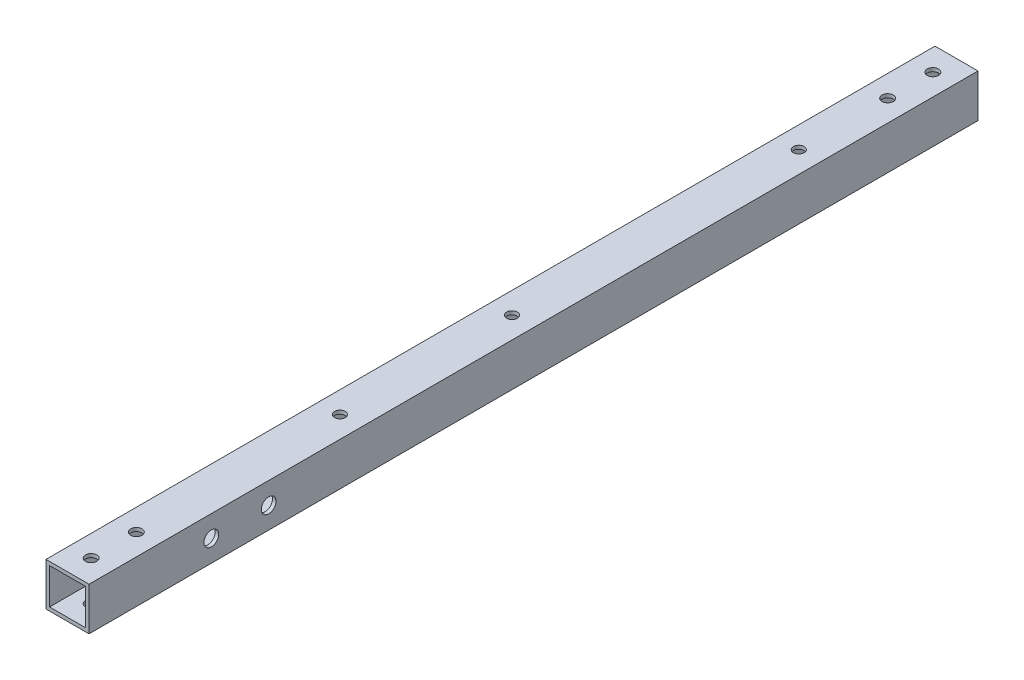
ISO-10303-21;
HEADER;
FILE_DESCRIPTION(('STEP AP214'),'2;1');
FILE_NAME('part.step','',(''),(''),'','','');
FILE_SCHEMA(('AUTOMOTIVE_DESIGN { 1 0 10303 214 1 1 1 1 }'));
ENDSEC;
DATA;
#1=APPLICATION_CONTEXT('core data for automotive mechanical design processes');
#2=APPLICATION_PROTOCOL_DEFINITION('international standard','automotive_design',2000,#1);
#3=PRODUCT_CONTEXT('',#1,'mechanical');
#4=PRODUCT('Part','Part','',(#3));
#5=PRODUCT_RELATED_PRODUCT_CATEGORY('part','',(#4));
#6=PRODUCT_DEFINITION_FORMATION('','',#4);
#7=PRODUCT_DEFINITION_CONTEXT('part definition',#1,'design');
#8=PRODUCT_DEFINITION('design','',#6,#7);
#9=PRODUCT_DEFINITION_SHAPE('','',#8);
#10=(LENGTH_UNIT() NAMED_UNIT(*) SI_UNIT(.MILLI.,.METRE.));
#11=(NAMED_UNIT(*) PLANE_ANGLE_UNIT() SI_UNIT($,.RADIAN.));
#12=(NAMED_UNIT(*) SI_UNIT($,.STERADIAN.) SOLID_ANGLE_UNIT());
#13=UNCERTAINTY_MEASURE_WITH_UNIT(LENGTH_MEASURE(1.E-05),#10,'distance_accuracy_value','');
#14=(GEOMETRIC_REPRESENTATION_CONTEXT(3) GLOBAL_UNCERTAINTY_ASSIGNED_CONTEXT((#13)) GLOBAL_UNIT_ASSIGNED_CONTEXT((#10,
#11,#12)) REPRESENTATION_CONTEXT('',''));
#15=CARTESIAN_POINT('',(0.,0.,0.));
#16=DIRECTION('',(0.,0.,1.));
#17=DIRECTION('',(1.,0.,0.));
#18=AXIS2_PLACEMENT_3D('',#15,#16,#17);
#19=CARTESIAN_POINT('',(0.,0.,196.85));
#20=DIRECTION('',(0.,0.,-1.));
#21=DIRECTION('',(-1.,0.,0.));
#22=AXIS2_PLACEMENT_3D('',#19,#20,#21);
#23=PLANE('',#22);
#24=DIRECTION('',(0.,1.,0.));
#25=VECTOR('',#24,1.);
#26=CARTESIAN_POINT('',(9.525,-9.525,196.85));
#27=LINE('',#26,#25);
#28=CARTESIAN_POINT('',(9.525,-9.525,196.85));
#29=VERTEX_POINT('',#28);
#30=CARTESIAN_POINT('',(9.525,9.525,196.85));
#31=VERTEX_POINT('',#30);
#32=EDGE_CURVE('E137',#29,#31,#27,.T.);
#33=ORIENTED_EDGE('',*,*,#32,.T.);
#34=DIRECTION('',(-1.,0.,0.));
#35=VECTOR('',#34,1.);
#36=CARTESIAN_POINT('',(-9.525,9.525,196.85));
#37=LINE('',#36,#35);
#38=CARTESIAN_POINT('',(-9.525,9.525,196.85));
#39=VERTEX_POINT('',#38);
#40=EDGE_CURVE('E140',#31,#39,#37,.T.);
#41=ORIENTED_EDGE('',*,*,#40,.T.);
#42=DIRECTION('',(0.,-1.,0.));
#43=VECTOR('',#42,1.);
#44=CARTESIAN_POINT('',(-9.525,-9.525,196.85));
#45=LINE('',#44,#43);
#46=CARTESIAN_POINT('',(-9.525,-9.525,196.85));
#47=VERTEX_POINT('',#46);
#48=EDGE_CURVE('E143',#39,#47,#45,.T.);
#49=ORIENTED_EDGE('',*,*,#48,.T.);
#50=DIRECTION('',(1.,0.,0.));
#51=VECTOR('',#50,1.);
#52=CARTESIAN_POINT('',(-9.525,-9.525,196.85));
#53=LINE('',#52,#51);
#54=EDGE_CURVE('E145',#47,#29,#53,.T.);
#55=ORIENTED_EDGE('',*,*,#54,.T.);
#56=EDGE_LOOP('',(#33,#41,#49,#55));
#57=FACE_BOUND('',#56,.T.);
#58=DIRECTION('',(0.,1.,0.));
#59=VECTOR('',#58,1.);
#60=CARTESIAN_POINT('',(7.9375,-7.9375,196.85));
#61=LINE('',#60,#59);
#62=CARTESIAN_POINT('',(7.9375,-7.9375,196.85));
#63=VERTEX_POINT('',#62);
#64=CARTESIAN_POINT('',(7.9375,7.9375,196.85));
#65=VERTEX_POINT('',#64);
#66=EDGE_CURVE('E99',#63,#65,#61,.T.);
#67=ORIENTED_EDGE('',*,*,#66,.F.);
#68=DIRECTION('',(1.,0.,0.));
#69=VECTOR('',#68,1.);
#70=CARTESIAN_POINT('',(-7.9375,-7.9375,196.85));
#71=LINE('',#70,#69);
#72=CARTESIAN_POINT('',(-7.9375,-7.9375,196.85));
#73=VERTEX_POINT('',#72);
#74=EDGE_CURVE('E121',#73,#63,#71,.T.);
#75=ORIENTED_EDGE('',*,*,#74,.F.);
#76=DIRECTION('',(0.,-1.,0.));
#77=VECTOR('',#76,1.);
#78=CARTESIAN_POINT('',(-7.9375,-7.9375,196.85));
#79=LINE('',#78,#77);
#80=CARTESIAN_POINT('',(-7.9375,7.9375,196.85));
#81=VERTEX_POINT('',#80);
#82=EDGE_CURVE('E119',#81,#73,#79,.T.);
#83=ORIENTED_EDGE('',*,*,#82,.F.);
#84=DIRECTION('',(-1.,0.,0.));
#85=VECTOR('',#84,1.);
#86=CARTESIAN_POINT('',(-7.9375,7.9375,196.85));
#87=LINE('',#86,#85);
#88=EDGE_CURVE('E107',#65,#81,#87,.T.);
#89=ORIENTED_EDGE('',*,*,#88,.F.);
#90=EDGE_LOOP('',(#67,#75,#83,#89));
#91=FACE_BOUND('',#90,.T.);
#92=ADVANCED_FACE('F32',(#57,#91),#23,.F.);
#93=CARTESIAN_POINT('',(0.,0.,-196.85));
#94=DIRECTION('',(0.,0.,-1.));
#95=DIRECTION('',(-1.,0.,0.));
#96=AXIS2_PLACEMENT_3D('',#93,#94,#95);
#97=PLANE('',#96);
#98=DIRECTION('',(0.,1.,0.));
#99=VECTOR('',#98,1.);
#100=CARTESIAN_POINT('',(9.525,-9.525,-196.85));
#101=LINE('',#100,#99);
#102=CARTESIAN_POINT('',(9.525,-9.525,-196.85));
#103=VERTEX_POINT('',#102);
#104=CARTESIAN_POINT('',(9.525,9.525,-196.85));
#105=VERTEX_POINT('',#104);
#106=EDGE_CURVE('E115',#103,#105,#101,.T.);
#107=ORIENTED_EDGE('',*,*,#106,.F.);
#108=DIRECTION('',(1.,0.,0.));
#109=VECTOR('',#108,1.);
#110=CARTESIAN_POINT('',(-9.525,-9.525,-196.85));
#111=LINE('',#110,#109);
#112=CARTESIAN_POINT('',(-9.525,-9.525,-196.85));
#113=VERTEX_POINT('',#112);
#114=EDGE_CURVE('E141',#113,#103,#111,.T.);
#115=ORIENTED_EDGE('',*,*,#114,.F.);
#116=DIRECTION('',(0.,-1.,0.));
#117=VECTOR('',#116,1.);
#118=CARTESIAN_POINT('',(-9.525,-9.525,-196.85));
#119=LINE('',#118,#117);
#120=CARTESIAN_POINT('',(-9.525,9.525,-196.85));
#121=VERTEX_POINT('',#120);
#122=EDGE_CURVE('E152',#121,#113,#119,.T.);
#123=ORIENTED_EDGE('',*,*,#122,.F.);
#124=DIRECTION('',(-1.,0.,0.));
#125=VECTOR('',#124,1.);
#126=CARTESIAN_POINT('',(-9.525,9.525,-196.85));
#127=LINE('',#126,#125);
#128=EDGE_CURVE('E150',#105,#121,#127,.T.);
#129=ORIENTED_EDGE('',*,*,#128,.F.);
#130=EDGE_LOOP('',(#107,#115,#123,#129));
#131=FACE_BOUND('',#130,.T.);
#132=DIRECTION('',(1.,0.,0.));
#133=VECTOR('',#132,1.);
#134=CARTESIAN_POINT('',(-7.9375,-7.9375,-196.85));
#135=LINE('',#134,#133);
#136=CARTESIAN_POINT('',(-7.9375,-7.9375,-196.85));
#137=VERTEX_POINT('',#136);
#138=CARTESIAN_POINT('',(7.9375,-7.9375,-196.85));
#139=VERTEX_POINT('',#138);
#140=EDGE_CURVE('E108',#137,#139,#135,.T.);
#141=ORIENTED_EDGE('',*,*,#140,.T.);
#142=DIRECTION('',(0.,1.,0.));
#143=VECTOR('',#142,1.);
#144=CARTESIAN_POINT('',(7.9375,-7.9375,-196.85));
#145=LINE('',#144,#143);
#146=CARTESIAN_POINT('',(7.9375,7.9375,-196.85));
#147=VERTEX_POINT('',#146);
#148=EDGE_CURVE('E57',#139,#147,#145,.T.);
#149=ORIENTED_EDGE('',*,*,#148,.T.);
#150=DIRECTION('',(-1.,0.,0.));
#151=VECTOR('',#150,1.);
#152=CARTESIAN_POINT('',(-7.9375,7.9375,-196.85));
#153=LINE('',#152,#151);
#154=CARTESIAN_POINT('',(-7.9375,7.9375,-196.85));
#155=VERTEX_POINT('',#154);
#156=EDGE_CURVE('E114',#147,#155,#153,.T.);
#157=ORIENTED_EDGE('',*,*,#156,.T.);
#158=DIRECTION('',(0.,-1.,0.));
#159=VECTOR('',#158,1.);
#160=CARTESIAN_POINT('',(-7.9375,-7.9375,-196.85));
#161=LINE('',#160,#159);
#162=EDGE_CURVE('E129',#155,#137,#161,.T.);
#163=ORIENTED_EDGE('',*,*,#162,.T.);
#164=EDGE_LOOP('',(#141,#149,#157,#163));
#165=FACE_BOUND('',#164,.T.);
#166=ADVANCED_FACE('F293',(#131,#165),#97,.T.);
#167=CARTESIAN_POINT('',(9.525,-9.525,196.85));
#168=DIRECTION('',(-1.,0.,0.));
#169=DIRECTION('',(0.,0.,1.));
#170=AXIS2_PLACEMENT_3D('',#167,#168,#169);
#171=PLANE('',#170);
#172=CARTESIAN_POINT('',(9.525,0.,142.675));
#173=DIRECTION('',(-1.,0.,0.));
#174=DIRECTION('',(0.,0.,1.));
#175=AXIS2_PLACEMENT_3D('',#172,#173,#174);
#176=CIRCLE('',#175,3.26390000000001);
#177=CARTESIAN_POINT('',(9.525,0.,145.9389));
#178=VERTEX_POINT('',#177);
#179=EDGE_CURVE('E176',#178,#178,#176,.T.);
#180=ORIENTED_EDGE('',*,*,#179,.T.);
#181=EDGE_LOOP('',(#180));
#182=FACE_BOUND('',#181,.T.);
#183=CARTESIAN_POINT('',(9.525,0.,117.275));
#184=DIRECTION('',(-1.,0.,0.));
#185=DIRECTION('',(0.,0.,1.));
#186=AXIS2_PLACEMENT_3D('',#183,#184,#185);
#187=CIRCLE('',#186,3.26389999999999);
#188=CARTESIAN_POINT('',(9.525,0.,120.5389));
#189=VERTEX_POINT('',#188);
#190=EDGE_CURVE('E191',#189,#189,#187,.T.);
#191=ORIENTED_EDGE('',*,*,#190,.T.);
#192=EDGE_LOOP('',(#191));
#193=FACE_BOUND('',#192,.T.);
#194=ORIENTED_EDGE('',*,*,#106,.T.);
#195=DIRECTION('',(0.,0.,-1.));
#196=VECTOR('',#195,1.);
#197=CARTESIAN_POINT('',(9.525,9.525,196.85));
#198=LINE('',#197,#196);
#199=EDGE_CURVE('E11',#31,#105,#198,.T.);
#200=ORIENTED_EDGE('',*,*,#199,.F.);
#201=ORIENTED_EDGE('',*,*,#32,.F.);
#202=DIRECTION('',(0.,0.,-1.));
#203=VECTOR('',#202,1.);
#204=CARTESIAN_POINT('',(9.525,-9.525,196.85));
#205=LINE('',#204,#203);
#206=EDGE_CURVE('E147',#29,#103,#205,.T.);
#207=ORIENTED_EDGE('',*,*,#206,.T.);
#208=EDGE_LOOP('',(#194,#200,#201,#207));
#209=FACE_BOUND('',#208,.T.);
#210=ADVANCED_FACE('F34',(#182,#193,#209),#171,.F.);
#211=CARTESIAN_POINT('',(-9.525,9.525,196.85));
#212=DIRECTION('',(0.,-1.,0.));
#213=DIRECTION('',(0.,0.,-1.));
#214=AXIS2_PLACEMENT_3D('',#211,#212,#213);
#215=PLANE('',#214);
#216=CARTESIAN_POINT('',(0.,9.525,-127.));
#217=DIRECTION('',(0.,-1.,0.));
#218=DIRECTION('',(0.,0.,-1.));
#219=AXIS2_PLACEMENT_3D('',#216,#217,#218);
#220=CIRCLE('',#219,2.38125000000011);
#221=CARTESIAN_POINT('',(0.,9.525,-129.38125));
#222=VERTEX_POINT('',#221);
#223=EDGE_CURVE('E186',#222,#222,#220,.T.);
#224=ORIENTED_EDGE('',*,*,#223,.T.);
#225=EDGE_LOOP('',(#224));
#226=FACE_BOUND('',#225,.T.);
#227=CARTESIAN_POINT('',(-2.67506386536077E-13,9.525,76.2));
#228=DIRECTION('',(0.,-1.,0.));
#229=DIRECTION('',(0.,0.,-1.));
#230=AXIS2_PLACEMENT_3D('',#227,#228,#229);
#231=CIRCLE('',#230,2.38125);
#232=CARTESIAN_POINT('',(-2.67506386536077E-13,9.525,73.81875));
#233=VERTEX_POINT('',#232);
#234=EDGE_CURVE('E215',#233,#233,#231,.T.);
#235=ORIENTED_EDGE('',*,*,#234,.T.);
#236=EDGE_LOOP('',(#235));
#237=FACE_BOUND('',#236,.T.);
#238=CARTESIAN_POINT('',(0.,9.525,0.));
#239=DIRECTION('',(0.,-1.,0.));
#240=DIRECTION('',(0.,0.,-1.));
#241=AXIS2_PLACEMENT_3D('',#238,#239,#240);
#242=CIRCLE('',#241,2.38125);
#243=CARTESIAN_POINT('',(0.,9.525,-2.38125));
#244=VERTEX_POINT('',#243);
#245=EDGE_CURVE('E198',#244,#244,#242,.T.);
#246=ORIENTED_EDGE('',*,*,#245,.T.);
#247=EDGE_LOOP('',(#246));
#248=FACE_BOUND('',#247,.T.);
#249=CARTESIAN_POINT('',(-1.37209959955431E-13,9.525,-166.375));
#250=DIRECTION('',(0.,-1.,0.));
#251=DIRECTION('',(0.,0.,-1.));
#252=AXIS2_PLACEMENT_3D('',#249,#250,#251);
#253=CIRCLE('',#252,2.50000000000001);
#254=CARTESIAN_POINT('',(-1.37209959955431E-13,9.525,-168.875));
#255=VERTEX_POINT('',#254);
#256=EDGE_CURVE('E166',#255,#255,#253,.F.);
#257=ORIENTED_EDGE('',*,*,#256,.F.);
#258=EDGE_LOOP('',(#257));
#259=FACE_BOUND('',#258,.T.);
#260=CARTESIAN_POINT('',(0.,9.525,-186.375));
#261=DIRECTION('',(0.,-1.,0.));
#262=DIRECTION('',(0.,0.,-1.));
#263=AXIS2_PLACEMENT_3D('',#260,#261,#262);
#264=CIRCLE('',#263,2.5);
#265=CARTESIAN_POINT('',(0.,9.525,-188.875));
#266=VERTEX_POINT('',#265);
#267=EDGE_CURVE('E181',#266,#266,#264,.F.);
#268=ORIENTED_EDGE('',*,*,#267,.F.);
#269=EDGE_LOOP('',(#268));
#270=FACE_BOUND('',#269,.T.);
#271=CARTESIAN_POINT('',(-1.37209959955431E-13,9.525,166.375));
#272=DIRECTION('',(0.,-1.,0.));
#273=DIRECTION('',(0.,0.,-1.));
#274=AXIS2_PLACEMENT_3D('',#271,#272,#273);
#275=CIRCLE('',#274,2.50000000000001);
#276=CARTESIAN_POINT('',(-1.37209959955431E-13,9.525,163.875));
#277=VERTEX_POINT('',#276);
#278=EDGE_CURVE('E127',#277,#277,#275,.T.);
#279=ORIENTED_EDGE('',*,*,#278,.T.);
#280=EDGE_LOOP('',(#279));
#281=FACE_BOUND('',#280,.T.);
#282=CARTESIAN_POINT('',(0.,9.525,186.375));
#283=DIRECTION('',(0.,-1.,0.));
#284=DIRECTION('',(0.,0.,-1.));
#285=AXIS2_PLACEMENT_3D('',#282,#283,#284);
#286=CIRCLE('',#285,2.5);
#287=CARTESIAN_POINT('',(0.,9.525,183.875));
#288=VERTEX_POINT('',#287);
#289=EDGE_CURVE('E171',#288,#288,#286,.T.);
#290=ORIENTED_EDGE('',*,*,#289,.T.);
#291=EDGE_LOOP('',(#290));
#292=FACE_BOUND('',#291,.T.);
#293=ORIENTED_EDGE('',*,*,#128,.T.);
#294=DIRECTION('',(0.,0.,-1.));
#295=VECTOR('',#294,1.);
#296=CARTESIAN_POINT('',(-9.525,9.525,196.85));
#297=LINE('',#296,#295);
#298=EDGE_CURVE('E41',#39,#121,#297,.T.);
#299=ORIENTED_EDGE('',*,*,#298,.F.);
#300=ORIENTED_EDGE('',*,*,#40,.F.);
#301=ORIENTED_EDGE('',*,*,#199,.T.);
#302=EDGE_LOOP('',(#293,#299,#300,#301));
#303=FACE_BOUND('',#302,.T.);
#304=ADVANCED_FACE('F268',(#226,#237,#248,#259,#270,#281,#292,#303),#215,.F.);
#305=CARTESIAN_POINT('',(-9.525,-9.525,196.85));
#306=DIRECTION('',(1.,0.,0.));
#307=DIRECTION('',(0.,0.,-1.));
#308=AXIS2_PLACEMENT_3D('',#305,#306,#307);
#309=PLANE('',#308);
#310=CARTESIAN_POINT('',(-9.525,0.,142.675));
#311=DIRECTION('',(1.,0.,0.));
#312=DIRECTION('',(0.,0.,-1.));
#313=AXIS2_PLACEMENT_3D('',#310,#311,#312);
#314=CIRCLE('',#313,3.26390000000001);
#315=CARTESIAN_POINT('',(-9.525,0.,139.4111));
#316=VERTEX_POINT('',#315);
#317=EDGE_CURVE('E235',#316,#316,#314,.T.);
#318=ORIENTED_EDGE('',*,*,#317,.T.);
#319=EDGE_LOOP('',(#318));
#320=FACE_BOUND('',#319,.T.);
#321=CARTESIAN_POINT('',(-9.525,0.,117.275));
#322=DIRECTION('',(1.,0.,0.));
#323=DIRECTION('',(0.,0.,-1.));
#324=AXIS2_PLACEMENT_3D('',#321,#322,#323);
#325=CIRCLE('',#324,3.26389999999999);
#326=CARTESIAN_POINT('',(-9.525,0.,114.0111));
#327=VERTEX_POINT('',#326);
#328=EDGE_CURVE('E228',#327,#327,#325,.T.);
#329=ORIENTED_EDGE('',*,*,#328,.T.);
#330=EDGE_LOOP('',(#329));
#331=FACE_BOUND('',#330,.T.);
#332=ORIENTED_EDGE('',*,*,#122,.T.);
#333=DIRECTION('',(0.,0.,-1.));
#334=VECTOR('',#333,1.);
#335=CARTESIAN_POINT('',(-9.525,-9.525,196.85));
#336=LINE('',#335,#334);
#337=EDGE_CURVE('E157',#47,#113,#336,.T.);
#338=ORIENTED_EDGE('',*,*,#337,.F.);
#339=ORIENTED_EDGE('',*,*,#48,.F.);
#340=ORIENTED_EDGE('',*,*,#298,.T.);
#341=EDGE_LOOP('',(#332,#338,#339,#340));
#342=FACE_BOUND('',#341,.T.);
#343=ADVANCED_FACE('F307',(#320,#331,#342),#309,.F.);
#344=CARTESIAN_POINT('',(-9.525,-9.525,196.85));
#345=DIRECTION('',(0.,1.,0.));
#346=DIRECTION('',(0.,0.,1.));
#347=AXIS2_PLACEMENT_3D('',#344,#345,#346);
#348=PLANE('',#347);
#349=CARTESIAN_POINT('',(0.,-9.525,-127.));
#350=DIRECTION('',(0.,1.,0.));
#351=DIRECTION('',(0.,0.,1.));
#352=AXIS2_PLACEMENT_3D('',#349,#350,#351);
#353=CIRCLE('',#352,2.38125000000011);
#354=CARTESIAN_POINT('',(0.,-9.525,-124.61875));
#355=VERTEX_POINT('',#354);
#356=EDGE_CURVE('E221',#355,#355,#353,.T.);
#357=ORIENTED_EDGE('',*,*,#356,.T.);
#358=EDGE_LOOP('',(#357));
#359=FACE_BOUND('',#358,.T.);
#360=CARTESIAN_POINT('',(-2.67506386536077E-13,-9.525,76.2));
#361=DIRECTION('',(0.,1.,0.));
#362=DIRECTION('',(0.,0.,1.));
#363=AXIS2_PLACEMENT_3D('',#360,#361,#362);
#364=CIRCLE('',#363,2.38125);
#365=CARTESIAN_POINT('',(-2.67506386536077E-13,-9.525,78.58125));
#366=VERTEX_POINT('',#365);
#367=EDGE_CURVE('E202',#366,#366,#364,.T.);
#368=ORIENTED_EDGE('',*,*,#367,.T.);
#369=EDGE_LOOP('',(#368));
#370=FACE_BOUND('',#369,.T.);
#371=CARTESIAN_POINT('',(0.,-9.525,0.));
#372=DIRECTION('',(0.,1.,0.));
#373=DIRECTION('',(0.,0.,1.));
#374=AXIS2_PLACEMENT_3D('',#371,#372,#373);
#375=CIRCLE('',#374,2.38125);
#376=CARTESIAN_POINT('',(0.,-9.525,2.38125));
#377=VERTEX_POINT('',#376);
#378=EDGE_CURVE('E205',#377,#377,#375,.T.);
#379=ORIENTED_EDGE('',*,*,#378,.T.);
#380=EDGE_LOOP('',(#379));
#381=FACE_BOUND('',#380,.T.);
#382=CARTESIAN_POINT('',(-1.37209959955431E-13,-9.525,-166.375));
#383=DIRECTION('',(0.,1.,0.));
#384=DIRECTION('',(0.,0.,1.));
#385=AXIS2_PLACEMENT_3D('',#382,#383,#384);
#386=CIRCLE('',#385,2.50000000000001);
#387=CARTESIAN_POINT('',(-1.37209959955431E-13,-9.525,-163.875));
#388=VERTEX_POINT('',#387);
#389=EDGE_CURVE('E249',#388,#388,#386,.F.);
#390=ORIENTED_EDGE('',*,*,#389,.F.);
#391=EDGE_LOOP('',(#390));
#392=FACE_BOUND('',#391,.T.);
#393=CARTESIAN_POINT('',(0.,-9.525,-186.375));
#394=DIRECTION('',(0.,1.,0.));
#395=DIRECTION('',(0.,0.,1.));
#396=AXIS2_PLACEMENT_3D('',#393,#394,#395);
#397=CIRCLE('',#396,2.5);
#398=CARTESIAN_POINT('',(0.,-9.525,-183.875));
#399=VERTEX_POINT('',#398);
#400=EDGE_CURVE('E242',#399,#399,#397,.F.);
#401=ORIENTED_EDGE('',*,*,#400,.F.);
#402=EDGE_LOOP('',(#401));
#403=FACE_BOUND('',#402,.T.);
#404=CARTESIAN_POINT('',(-1.37209959955431E-13,-9.525,166.375));
#405=DIRECTION('',(0.,1.,0.));
#406=DIRECTION('',(0.,0.,1.));
#407=AXIS2_PLACEMENT_3D('',#404,#405,#406);
#408=CIRCLE('',#407,2.50000000000001);
#409=CARTESIAN_POINT('',(-1.37209959955431E-13,-9.525,168.875));
#410=VERTEX_POINT('',#409);
#411=EDGE_CURVE('E263',#410,#410,#408,.T.);
#412=ORIENTED_EDGE('',*,*,#411,.T.);
#413=EDGE_LOOP('',(#412));
#414=FACE_BOUND('',#413,.T.);
#415=CARTESIAN_POINT('',(0.,-9.525,186.375));
#416=DIRECTION('',(0.,1.,0.));
#417=DIRECTION('',(0.,0.,1.));
#418=AXIS2_PLACEMENT_3D('',#415,#416,#417);
#419=CIRCLE('',#418,2.5);
#420=CARTESIAN_POINT('',(0.,-9.525,188.875));
#421=VERTEX_POINT('',#420);
#422=EDGE_CURVE('E256',#421,#421,#419,.T.);
#423=ORIENTED_EDGE('',*,*,#422,.T.);
#424=EDGE_LOOP('',(#423));
#425=FACE_BOUND('',#424,.T.);
#426=ORIENTED_EDGE('',*,*,#114,.T.);
#427=ORIENTED_EDGE('',*,*,#206,.F.);
#428=ORIENTED_EDGE('',*,*,#54,.F.);
#429=ORIENTED_EDGE('',*,*,#337,.T.);
#430=EDGE_LOOP('',(#426,#427,#428,#429));
#431=FACE_BOUND('',#430,.T.);
#432=ADVANCED_FACE('F304',(#359,#370,#381,#392,#403,#414,#425,#431),#348,.F.);
#433=CARTESIAN_POINT('',(7.9375,-7.9375,196.85));
#434=DIRECTION('',(-1.,0.,0.));
#435=DIRECTION('',(0.,-1.,0.));
#436=AXIS2_PLACEMENT_3D('',#433,#434,#435);
#437=PLANE('',#436);
#438=CARTESIAN_POINT('',(7.9375,0.,142.675));
#439=DIRECTION('',(-1.,0.,0.));
#440=DIRECTION('',(0.,-1.,0.));
#441=AXIS2_PLACEMENT_3D('',#438,#439,#440);
#442=CIRCLE('',#441,3.26390000000001);
#443=CARTESIAN_POINT('',(7.9375,-3.26390000000001,142.675));
#444=VERTEX_POINT('',#443);
#445=EDGE_CURVE('E190',#444,#444,#442,.T.);
#446=ORIENTED_EDGE('',*,*,#445,.F.);
#447=EDGE_LOOP('',(#446));
#448=FACE_BOUND('',#447,.T.);
#449=CARTESIAN_POINT('',(7.9375,0.,117.275));
#450=DIRECTION('',(-1.,0.,0.));
#451=DIRECTION('',(0.,-1.,0.));
#452=AXIS2_PLACEMENT_3D('',#449,#450,#451);
#453=CIRCLE('',#452,3.26389999999999);
#454=CARTESIAN_POINT('',(7.9375,-3.26389999999999,117.275));
#455=VERTEX_POINT('',#454);
#456=EDGE_CURVE('E185',#455,#455,#453,.T.);
#457=ORIENTED_EDGE('',*,*,#456,.F.);
#458=EDGE_LOOP('',(#457));
#459=FACE_BOUND('',#458,.T.);
#460=ORIENTED_EDGE('',*,*,#148,.F.);
#461=DIRECTION('',(0.,0.,-1.));
#462=VECTOR('',#461,1.);
#463=CARTESIAN_POINT('',(7.9375,-7.9375,196.85));
#464=LINE('',#463,#462);
#465=EDGE_CURVE('E103',#63,#139,#464,.T.);
#466=ORIENTED_EDGE('',*,*,#465,.F.);
#467=ORIENTED_EDGE('',*,*,#66,.T.);
#468=DIRECTION('',(0.,0.,-1.));
#469=VECTOR('',#468,1.);
#470=CARTESIAN_POINT('',(7.9375,7.9375,196.85));
#471=LINE('',#470,#469);
#472=EDGE_CURVE('E102',#65,#147,#471,.T.);
#473=ORIENTED_EDGE('',*,*,#472,.T.);
#474=EDGE_LOOP('',(#460,#466,#467,#473));
#475=FACE_BOUND('',#474,.T.);
#476=ADVANCED_FACE('F101',(#448,#459,#475),#437,.T.);
#477=CARTESIAN_POINT('',(-7.9375,7.9375,196.85));
#478=DIRECTION('',(0.,-1.,0.));
#479=DIRECTION('',(0.,0.,-1.));
#480=AXIS2_PLACEMENT_3D('',#477,#478,#479);
#481=PLANE('',#480);
#482=CARTESIAN_POINT('',(0.,7.9375,-127.));
#483=DIRECTION('',(0.,-1.,0.));
#484=DIRECTION('',(0.,0.,-1.));
#485=AXIS2_PLACEMENT_3D('',#482,#483,#484);
#486=CIRCLE('',#485,2.38125000000011);
#487=CARTESIAN_POINT('',(0.,7.9375,-129.38125));
#488=VERTEX_POINT('',#487);
#489=EDGE_CURVE('E218',#488,#488,#486,.T.);
#490=ORIENTED_EDGE('',*,*,#489,.F.);
#491=EDGE_LOOP('',(#490));
#492=FACE_BOUND('',#491,.T.);
#493=CARTESIAN_POINT('',(-2.67506386536077E-13,7.9375,76.2));
#494=DIRECTION('',(0.,-1.,0.));
#495=DIRECTION('',(0.,0.,-1.));
#496=AXIS2_PLACEMENT_3D('',#493,#494,#495);
#497=CIRCLE('',#496,2.38125);
#498=CARTESIAN_POINT('',(-2.67506386536077E-13,7.9375,73.81875));
#499=VERTEX_POINT('',#498);
#500=EDGE_CURVE('E197',#499,#499,#497,.T.);
#501=ORIENTED_EDGE('',*,*,#500,.F.);
#502=EDGE_LOOP('',(#501));
#503=FACE_BOUND('',#502,.T.);
#504=CARTESIAN_POINT('',(0.,7.9375,0.));
#505=DIRECTION('',(0.,-1.,0.));
#506=DIRECTION('',(0.,0.,-1.));
#507=AXIS2_PLACEMENT_3D('',#504,#505,#506);
#508=CIRCLE('',#507,2.38125);
#509=CARTESIAN_POINT('',(0.,7.9375,-2.38125));
#510=VERTEX_POINT('',#509);
#511=EDGE_CURVE('E194',#510,#510,#508,.T.);
#512=ORIENTED_EDGE('',*,*,#511,.F.);
#513=EDGE_LOOP('',(#512));
#514=FACE_BOUND('',#513,.T.);
#515=CARTESIAN_POINT('',(-1.37209959955431E-13,7.9375,-166.375));
#516=DIRECTION('',(0.,-1.,0.));
#517=DIRECTION('',(0.,0.,-1.));
#518=AXIS2_PLACEMENT_3D('',#515,#516,#517);
#519=CIRCLE('',#518,2.50000000000001);
#520=CARTESIAN_POINT('',(-1.37209959955431E-13,7.9375,-168.875));
#521=VERTEX_POINT('',#520);
#522=EDGE_CURVE('E180',#521,#521,#519,.F.);
#523=ORIENTED_EDGE('',*,*,#522,.T.);
#524=EDGE_LOOP('',(#523));
#525=FACE_BOUND('',#524,.T.);
#526=CARTESIAN_POINT('',(0.,7.9375,-186.375));
#527=DIRECTION('',(0.,-1.,0.));
#528=DIRECTION('',(0.,0.,-1.));
#529=AXIS2_PLACEMENT_3D('',#526,#527,#528);
#530=CIRCLE('',#529,2.5);
#531=CARTESIAN_POINT('',(0.,7.9375,-188.875));
#532=VERTEX_POINT('',#531);
#533=EDGE_CURVE('E175',#532,#532,#530,.F.);
#534=ORIENTED_EDGE('',*,*,#533,.T.);
#535=EDGE_LOOP('',(#534));
#536=FACE_BOUND('',#535,.T.);
#537=CARTESIAN_POINT('',(-1.37209959955431E-13,7.9375,166.375));
#538=DIRECTION('',(0.,-1.,0.));
#539=DIRECTION('',(0.,0.,-1.));
#540=AXIS2_PLACEMENT_3D('',#537,#538,#539);
#541=CIRCLE('',#540,2.50000000000001);
#542=CARTESIAN_POINT('',(-1.37209959955431E-13,7.9375,163.875));
#543=VERTEX_POINT('',#542);
#544=EDGE_CURVE('E170',#543,#543,#541,.T.);
#545=ORIENTED_EDGE('',*,*,#544,.F.);
#546=EDGE_LOOP('',(#545));
#547=FACE_BOUND('',#546,.T.);
#548=CARTESIAN_POINT('',(0.,7.9375,186.375));
#549=DIRECTION('',(0.,-1.,0.));
#550=DIRECTION('',(0.,0.,-1.));
#551=AXIS2_PLACEMENT_3D('',#548,#549,#550);
#552=CIRCLE('',#551,2.5);
#553=CARTESIAN_POINT('',(0.,7.9375,183.875));
#554=VERTEX_POINT('',#553);
#555=EDGE_CURVE('E165',#554,#554,#552,.T.);
#556=ORIENTED_EDGE('',*,*,#555,.F.);
#557=EDGE_LOOP('',(#556));
#558=FACE_BOUND('',#557,.T.);
#559=ORIENTED_EDGE('',*,*,#156,.F.);
#560=ORIENTED_EDGE('',*,*,#472,.F.);
#561=ORIENTED_EDGE('',*,*,#88,.T.);
#562=DIRECTION('',(0.,0.,-1.));
#563=VECTOR('',#562,1.);
#564=CARTESIAN_POINT('',(-7.9375,7.9375,196.85));
#565=LINE('',#564,#563);
#566=EDGE_CURVE('E116',#81,#155,#565,.T.);
#567=ORIENTED_EDGE('',*,*,#566,.T.);
#568=EDGE_LOOP('',(#559,#560,#561,#567));
#569=FACE_BOUND('',#568,.T.);
#570=ADVANCED_FACE('F111',(#492,#503,#514,#525,#536,#547,#558,#569),#481,.T.);
#571=CARTESIAN_POINT('',(-7.9375,-7.9375,196.85));
#572=DIRECTION('',(1.,0.,0.));
#573=DIRECTION('',(0.,0.,-1.));
#574=AXIS2_PLACEMENT_3D('',#571,#572,#573);
#575=PLANE('',#574);
#576=CARTESIAN_POINT('',(-7.9375,0.,142.675));
#577=DIRECTION('',(1.,0.,0.));
#578=DIRECTION('',(0.,0.,-1.));
#579=AXIS2_PLACEMENT_3D('',#576,#577,#578);
#580=CIRCLE('',#579,3.26390000000001);
#581=CARTESIAN_POINT('',(-7.9375,0.,139.4111));
#582=VERTEX_POINT('',#581);
#583=EDGE_CURVE('E187',#582,#582,#580,.T.);
#584=ORIENTED_EDGE('',*,*,#583,.F.);
#585=EDGE_LOOP('',(#584));
#586=FACE_BOUND('',#585,.T.);
#587=CARTESIAN_POINT('',(-7.9375,0.,117.275));
#588=DIRECTION('',(1.,0.,0.));
#589=DIRECTION('',(0.,0.,-1.));
#590=AXIS2_PLACEMENT_3D('',#587,#588,#589);
#591=CIRCLE('',#590,3.26389999999999);
#592=CARTESIAN_POINT('',(-7.9375,0.,114.0111));
#593=VERTEX_POINT('',#592);
#594=EDGE_CURVE('E182',#593,#593,#591,.T.);
#595=ORIENTED_EDGE('',*,*,#594,.F.);
#596=EDGE_LOOP('',(#595));
#597=FACE_BOUND('',#596,.T.);
#598=ORIENTED_EDGE('',*,*,#162,.F.);
#599=ORIENTED_EDGE('',*,*,#566,.F.);
#600=ORIENTED_EDGE('',*,*,#82,.T.);
#601=DIRECTION('',(0.,0.,-1.));
#602=VECTOR('',#601,1.);
#603=CARTESIAN_POINT('',(-7.9375,-7.9375,196.85));
#604=LINE('',#603,#602);
#605=EDGE_CURVE('E49',#73,#137,#604,.T.);
#606=ORIENTED_EDGE('',*,*,#605,.T.);
#607=EDGE_LOOP('',(#598,#599,#600,#606));
#608=FACE_BOUND('',#607,.T.);
#609=ADVANCED_FACE('F404',(#586,#597,#608),#575,.T.);
#610=CARTESIAN_POINT('',(-7.9375,-7.9375,196.85));
#611=DIRECTION('',(0.,1.,0.));
#612=DIRECTION('',(0.,0.,1.));
#613=AXIS2_PLACEMENT_3D('',#610,#611,#612);
#614=PLANE('',#613);
#615=CARTESIAN_POINT('',(0.,-7.9375,-127.));
#616=DIRECTION('',(0.,1.,0.));
#617=DIRECTION('',(0.,0.,1.));
#618=AXIS2_PLACEMENT_3D('',#615,#616,#617);
#619=CIRCLE('',#618,2.38125000000011);
#620=CARTESIAN_POINT('',(0.,-7.9375,-124.61875));
#621=VERTEX_POINT('',#620);
#622=EDGE_CURVE('E36',#621,#621,#619,.T.);
#623=ORIENTED_EDGE('',*,*,#622,.F.);
#624=EDGE_LOOP('',(#623));
#625=FACE_BOUND('',#624,.T.);
#626=CARTESIAN_POINT('',(-2.67506386536077E-13,-7.9375,76.2));
#627=DIRECTION('',(0.,1.,0.));
#628=DIRECTION('',(0.,0.,1.));
#629=AXIS2_PLACEMENT_3D('',#626,#627,#628);
#630=CIRCLE('',#629,2.38125);
#631=CARTESIAN_POINT('',(-2.67506386536077E-13,-7.9375,78.58125));
#632=VERTEX_POINT('',#631);
#633=EDGE_CURVE('E195',#632,#632,#630,.T.);
#634=ORIENTED_EDGE('',*,*,#633,.F.);
#635=EDGE_LOOP('',(#634));
#636=FACE_BOUND('',#635,.T.);
#637=CARTESIAN_POINT('',(0.,-7.9375,0.));
#638=DIRECTION('',(0.,1.,0.));
#639=DIRECTION('',(0.,0.,1.));
#640=AXIS2_PLACEMENT_3D('',#637,#638,#639);
#641=CIRCLE('',#640,2.38125);
#642=CARTESIAN_POINT('',(0.,-7.9375,2.38125));
#643=VERTEX_POINT('',#642);
#644=EDGE_CURVE('E192',#643,#643,#641,.T.);
#645=ORIENTED_EDGE('',*,*,#644,.F.);
#646=EDGE_LOOP('',(#645));
#647=FACE_BOUND('',#646,.T.);
#648=CARTESIAN_POINT('',(-1.37209959955431E-13,-7.9375,-166.375));
#649=DIRECTION('',(0.,1.,0.));
#650=DIRECTION('',(0.,0.,1.));
#651=AXIS2_PLACEMENT_3D('',#648,#649,#650);
#652=CIRCLE('',#651,2.50000000000001);
#653=CARTESIAN_POINT('',(-1.37209959955431E-13,-7.9375,-163.875));
#654=VERTEX_POINT('',#653);
#655=EDGE_CURVE('E177',#654,#654,#652,.F.);
#656=ORIENTED_EDGE('',*,*,#655,.T.);
#657=EDGE_LOOP('',(#656));
#658=FACE_BOUND('',#657,.T.);
#659=CARTESIAN_POINT('',(0.,-7.9375,-186.375));
#660=DIRECTION('',(0.,1.,0.));
#661=DIRECTION('',(0.,0.,1.));
#662=AXIS2_PLACEMENT_3D('',#659,#660,#661);
#663=CIRCLE('',#662,2.5);
#664=CARTESIAN_POINT('',(0.,-7.9375,-183.875));
#665=VERTEX_POINT('',#664);
#666=EDGE_CURVE('E172',#665,#665,#663,.F.);
#667=ORIENTED_EDGE('',*,*,#666,.T.);
#668=EDGE_LOOP('',(#667));
#669=FACE_BOUND('',#668,.T.);
#670=CARTESIAN_POINT('',(-1.37209959955431E-13,-7.9375,166.375));
#671=DIRECTION('',(0.,1.,0.));
#672=DIRECTION('',(0.,0.,1.));
#673=AXIS2_PLACEMENT_3D('',#670,#671,#672);
#674=CIRCLE('',#673,2.50000000000001);
#675=CARTESIAN_POINT('',(-1.37209959955431E-13,-7.9375,168.875));
#676=VERTEX_POINT('',#675);
#677=EDGE_CURVE('E167',#676,#676,#674,.T.);
#678=ORIENTED_EDGE('',*,*,#677,.F.);
#679=EDGE_LOOP('',(#678));
#680=FACE_BOUND('',#679,.T.);
#681=CARTESIAN_POINT('',(0.,-7.9375,186.375));
#682=DIRECTION('',(0.,1.,0.));
#683=DIRECTION('',(0.,0.,1.));
#684=AXIS2_PLACEMENT_3D('',#681,#682,#683);
#685=CIRCLE('',#684,2.5);
#686=CARTESIAN_POINT('',(0.,-7.9375,188.875));
#687=VERTEX_POINT('',#686);
#688=EDGE_CURVE('E162',#687,#687,#685,.T.);
#689=ORIENTED_EDGE('',*,*,#688,.F.);
#690=EDGE_LOOP('',(#689));
#691=FACE_BOUND('',#690,.T.);
#692=ORIENTED_EDGE('',*,*,#140,.F.);
#693=ORIENTED_EDGE('',*,*,#605,.F.);
#694=ORIENTED_EDGE('',*,*,#74,.T.);
#695=ORIENTED_EDGE('',*,*,#465,.T.);
#696=EDGE_LOOP('',(#692,#693,#694,#695));
#697=FACE_BOUND('',#696,.T.);
#698=ADVANCED_FACE('F402',(#625,#636,#647,#658,#669,#680,#691,#697),#614,.T.);
#699=CARTESIAN_POINT('',(0.,-16.475,186.375));
#700=DIRECTION('',(0.,1.,0.));
#701=DIRECTION('',(0.,0.,1.));
#702=AXIS2_PLACEMENT_3D('',#699,#700,#701);
#703=CYLINDRICAL_SURFACE('',#702,2.5);
#704=ORIENTED_EDGE('',*,*,#688,.T.);
#705=EDGE_LOOP('',(#704));
#706=FACE_BOUND('',#705,.T.);
#707=ORIENTED_EDGE('',*,*,#422,.F.);
#708=EDGE_LOOP('',(#707));
#709=FACE_BOUND('',#708,.T.);
#710=ADVANCED_FACE('F288',(#706,#709),#703,.F.);
#711=CARTESIAN_POINT('',(-1.37209959955431E-13,-16.475,166.375));
#712=DIRECTION('',(0.,1.,0.));
#713=DIRECTION('',(0.,0.,1.));
#714=AXIS2_PLACEMENT_3D('',#711,#712,#713);
#715=CYLINDRICAL_SURFACE('',#714,2.50000000000001);
#716=ORIENTED_EDGE('',*,*,#677,.T.);
#717=EDGE_LOOP('',(#716));
#718=FACE_BOUND('',#717,.T.);
#719=ORIENTED_EDGE('',*,*,#411,.F.);
#720=EDGE_LOOP('',(#719));
#721=FACE_BOUND('',#720,.T.);
#722=ADVANCED_FACE('F277',(#718,#721),#715,.F.);
#723=ORIENTED_EDGE('',*,*,#555,.T.);
#724=EDGE_LOOP('',(#723));
#725=FACE_BOUND('',#724,.T.);
#726=ORIENTED_EDGE('',*,*,#289,.F.);
#727=EDGE_LOOP('',(#726));
#728=FACE_BOUND('',#727,.T.);
#729=ADVANCED_FACE('F274',(#725,#728),#703,.F.);
#730=ORIENTED_EDGE('',*,*,#544,.T.);
#731=EDGE_LOOP('',(#730));
#732=FACE_BOUND('',#731,.T.);
#733=ORIENTED_EDGE('',*,*,#278,.F.);
#734=EDGE_LOOP('',(#733));
#735=FACE_BOUND('',#734,.T.);
#736=ADVANCED_FACE('F271',(#732,#735),#715,.F.);
#737=CARTESIAN_POINT('',(0.,-16.475,-186.375));
#738=DIRECTION('',(0.,1.,0.));
#739=DIRECTION('',(0.,0.,1.));
#740=AXIS2_PLACEMENT_3D('',#737,#738,#739);
#741=CYLINDRICAL_SURFACE('',#740,2.5);
#742=ORIENTED_EDGE('',*,*,#666,.F.);
#743=EDGE_LOOP('',(#742));
#744=FACE_BOUND('',#743,.T.);
#745=ORIENTED_EDGE('',*,*,#400,.T.);
#746=EDGE_LOOP('',(#745));
#747=FACE_BOUND('',#746,.T.);
#748=ADVANCED_FACE('F273',(#744,#747),#741,.F.);
#749=CARTESIAN_POINT('',(-1.37209959955431E-13,-16.475,-166.375));
#750=DIRECTION('',(0.,1.,0.));
#751=DIRECTION('',(0.,0.,1.));
#752=AXIS2_PLACEMENT_3D('',#749,#750,#751);
#753=CYLINDRICAL_SURFACE('',#752,2.50000000000001);
#754=ORIENTED_EDGE('',*,*,#655,.F.);
#755=EDGE_LOOP('',(#754));
#756=FACE_BOUND('',#755,.T.);
#757=ORIENTED_EDGE('',*,*,#389,.T.);
#758=EDGE_LOOP('',(#757));
#759=FACE_BOUND('',#758,.T.);
#760=ADVANCED_FACE('F282',(#756,#759),#753,.F.);
#761=ORIENTED_EDGE('',*,*,#533,.F.);
#762=EDGE_LOOP('',(#761));
#763=FACE_BOUND('',#762,.T.);
#764=ORIENTED_EDGE('',*,*,#267,.T.);
#765=EDGE_LOOP('',(#764));
#766=FACE_BOUND('',#765,.T.);
#767=ADVANCED_FACE('F285',(#763,#766),#741,.F.);
#768=ORIENTED_EDGE('',*,*,#522,.F.);
#769=EDGE_LOOP('',(#768));
#770=FACE_BOUND('',#769,.T.);
#771=ORIENTED_EDGE('',*,*,#256,.T.);
#772=EDGE_LOOP('',(#771));
#773=FACE_BOUND('',#772,.T.);
#774=ADVANCED_FACE('F327',(#770,#773),#753,.F.);
#775=CARTESIAN_POINT('',(15.6998,0.,117.275));
#776=DIRECTION('',(-1.,0.,0.));
#777=DIRECTION('',(0.,0.,1.));
#778=AXIS2_PLACEMENT_3D('',#775,#776,#777);
#779=CYLINDRICAL_SURFACE('',#778,3.26389999999999);
#780=ORIENTED_EDGE('',*,*,#594,.T.);
#781=EDGE_LOOP('',(#780));
#782=FACE_BOUND('',#781,.T.);
#783=ORIENTED_EDGE('',*,*,#328,.F.);
#784=EDGE_LOOP('',(#783));
#785=FACE_BOUND('',#784,.T.);
#786=ADVANCED_FACE('F333',(#782,#785),#779,.F.);
#787=CARTESIAN_POINT('',(15.6998,0.,142.675));
#788=DIRECTION('',(-1.,0.,0.));
#789=DIRECTION('',(0.,0.,1.));
#790=AXIS2_PLACEMENT_3D('',#787,#788,#789);
#791=CYLINDRICAL_SURFACE('',#790,3.26390000000001);
#792=ORIENTED_EDGE('',*,*,#583,.T.);
#793=EDGE_LOOP('',(#792));
#794=FACE_BOUND('',#793,.T.);
#795=ORIENTED_EDGE('',*,*,#317,.F.);
#796=EDGE_LOOP('',(#795));
#797=FACE_BOUND('',#796,.T.);
#798=ADVANCED_FACE('F343',(#794,#797),#791,.F.);
#799=ORIENTED_EDGE('',*,*,#456,.T.);
#800=EDGE_LOOP('',(#799));
#801=FACE_BOUND('',#800,.T.);
#802=ORIENTED_EDGE('',*,*,#190,.F.);
#803=EDGE_LOOP('',(#802));
#804=FACE_BOUND('',#803,.T.);
#805=ADVANCED_FACE('F339',(#801,#804),#779,.F.);
#806=ORIENTED_EDGE('',*,*,#445,.T.);
#807=EDGE_LOOP('',(#806));
#808=FACE_BOUND('',#807,.T.);
#809=ORIENTED_EDGE('',*,*,#179,.F.);
#810=EDGE_LOOP('',(#809));
#811=FACE_BOUND('',#810,.T.);
#812=ADVANCED_FACE('F342',(#808,#811),#791,.F.);
#813=CARTESIAN_POINT('',(0.,-11.8136,0.));
#814=DIRECTION('',(0.,1.,0.));
#815=DIRECTION('',(0.,0.,1.));
#816=AXIS2_PLACEMENT_3D('',#813,#814,#815);
#817=CYLINDRICAL_SURFACE('',#816,2.38125);
#818=ORIENTED_EDGE('',*,*,#644,.T.);
#819=EDGE_LOOP('',(#818));
#820=FACE_BOUND('',#819,.T.);
#821=ORIENTED_EDGE('',*,*,#378,.F.);
#822=EDGE_LOOP('',(#821));
#823=FACE_BOUND('',#822,.T.);
#824=ADVANCED_FACE('F347',(#820,#823),#817,.F.);
#825=CARTESIAN_POINT('',(-2.67506386536077E-13,-11.8136,76.2));
#826=DIRECTION('',(0.,1.,0.));
#827=DIRECTION('',(0.,0.,1.));
#828=AXIS2_PLACEMENT_3D('',#825,#826,#827);
#829=CYLINDRICAL_SURFACE('',#828,2.38125);
#830=ORIENTED_EDGE('',*,*,#633,.T.);
#831=EDGE_LOOP('',(#830));
#832=FACE_BOUND('',#831,.T.);
#833=ORIENTED_EDGE('',*,*,#367,.F.);
#834=EDGE_LOOP('',(#833));
#835=FACE_BOUND('',#834,.T.);
#836=ADVANCED_FACE('F359',(#832,#835),#829,.F.);
#837=CARTESIAN_POINT('',(0.,-11.8136,-127.));
#838=DIRECTION('',(0.,1.,0.));
#839=DIRECTION('',(0.,0.,1.));
#840=AXIS2_PLACEMENT_3D('',#837,#838,#839);
#841=CYLINDRICAL_SURFACE('',#840,2.38125000000011);
#842=ORIENTED_EDGE('',*,*,#622,.T.);
#843=EDGE_LOOP('',(#842));
#844=FACE_BOUND('',#843,.T.);
#845=ORIENTED_EDGE('',*,*,#356,.F.);
#846=EDGE_LOOP('',(#845));
#847=FACE_BOUND('',#846,.T.);
#848=ADVANCED_FACE('F353',(#844,#847),#841,.F.);
#849=ORIENTED_EDGE('',*,*,#511,.T.);
#850=EDGE_LOOP('',(#849));
#851=FACE_BOUND('',#850,.T.);
#852=ORIENTED_EDGE('',*,*,#245,.F.);
#853=EDGE_LOOP('',(#852));
#854=FACE_BOUND('',#853,.T.);
#855=ADVANCED_FACE('F349',(#851,#854),#817,.F.);
#856=ORIENTED_EDGE('',*,*,#500,.T.);
#857=EDGE_LOOP('',(#856));
#858=FACE_BOUND('',#857,.T.);
#859=ORIENTED_EDGE('',*,*,#234,.F.);
#860=EDGE_LOOP('',(#859));
#861=FACE_BOUND('',#860,.T.);
#862=ADVANCED_FACE('F352',(#858,#861),#829,.F.);
#863=ORIENTED_EDGE('',*,*,#489,.T.);
#864=EDGE_LOOP('',(#863));
#865=FACE_BOUND('',#864,.T.);
#866=ORIENTED_EDGE('',*,*,#223,.F.);
#867=EDGE_LOOP('',(#866));
#868=FACE_BOUND('',#867,.T.);
#869=ADVANCED_FACE('F357',(#865,#868),#841,.F.);
#870=CLOSED_SHELL('',(#92,#166,#210,#304,#343,#432,#476,#570,#609,#698,#710,#722,#729,#736,#748,
#760,#767,#774,#786,#798,#805,#812,#824,#836,#848,#855,#862,#869));
#871=MANIFOLD_SOLID_BREP('B2',#870);
#872=ADVANCED_BREP_SHAPE_REPRESENTATION('',(#18,#871),#14);
#873=SHAPE_DEFINITION_REPRESENTATION(#9,#872);
ENDSEC;
END-ISO-10303-21;
